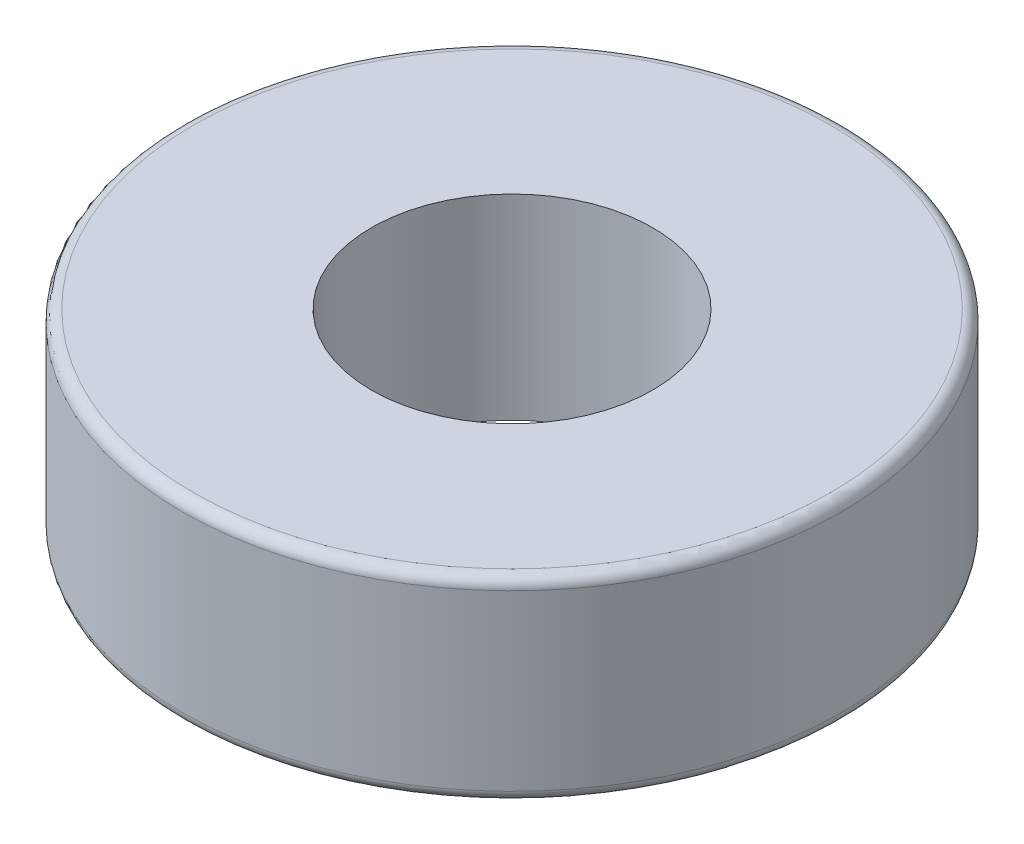
ISO-10303-21;
HEADER;
FILE_DESCRIPTION(('STEP AP214'),'2;1');
FILE_NAME('part.step','',(''),(''),'','','');
FILE_SCHEMA(('AUTOMOTIVE_DESIGN { 1 0 10303 214 1 1 1 1 }'));
ENDSEC;
DATA;
#1=APPLICATION_CONTEXT('core data for automotive mechanical design processes');
#2=APPLICATION_PROTOCOL_DEFINITION('international standard','automotive_design',2000,#1);
#3=PRODUCT_CONTEXT('',#1,'mechanical');
#4=PRODUCT('Part','Part','',(#3));
#5=PRODUCT_RELATED_PRODUCT_CATEGORY('part','',(#4));
#6=PRODUCT_DEFINITION_FORMATION('','',#4);
#7=PRODUCT_DEFINITION_CONTEXT('part definition',#1,'design');
#8=PRODUCT_DEFINITION('design','',#6,#7);
#9=PRODUCT_DEFINITION_SHAPE('','',#8);
#10=(LENGTH_UNIT() NAMED_UNIT(*) SI_UNIT(.MILLI.,.METRE.));
#11=(NAMED_UNIT(*) PLANE_ANGLE_UNIT() SI_UNIT($,.RADIAN.));
#12=(NAMED_UNIT(*) SI_UNIT($,.STERADIAN.) SOLID_ANGLE_UNIT());
#13=UNCERTAINTY_MEASURE_WITH_UNIT(LENGTH_MEASURE(1.E-05),#10,'distance_accuracy_value','');
#14=(GEOMETRIC_REPRESENTATION_CONTEXT(3) GLOBAL_UNCERTAINTY_ASSIGNED_CONTEXT((#13)) GLOBAL_UNIT_ASSIGNED_CONTEXT((#10,
#11,#12)) REPRESENTATION_CONTEXT('',''));
#15=CARTESIAN_POINT('',(0.,0.,0.));
#16=DIRECTION('',(0.,0.,1.));
#17=DIRECTION('',(1.,0.,0.));
#18=AXIS2_PLACEMENT_3D('',#15,#16,#17);
#19=CARTESIAN_POINT('',(0.,13.97,0.));
#20=DIRECTION('',(0.,1.,0.));
#21=DIRECTION('',(0.,0.,1.));
#22=AXIS2_PLACEMENT_3D('',#19,#20,#21);
#23=PLANE('',#22);
#24=CARTESIAN_POINT('',(0.,13.97,0.));
#25=DIRECTION('',(0.,1.,0.));
#26=DIRECTION('',(0.,0.,1.));
#27=AXIS2_PLACEMENT_3D('',#24,#25,#26);
#28=CIRCLE('',#27,22.70125);
#29=CARTESIAN_POINT('',(0.,13.97,22.70125));
#30=VERTEX_POINT('',#29);
#31=EDGE_CURVE('E10',#30,#30,#28,.T.);
#32=ORIENTED_EDGE('',*,*,#31,.T.);
#33=EDGE_LOOP('',(#32));
#34=FACE_BOUND('',#33,.T.);
#35=CARTESIAN_POINT('',(0.,13.97,0.));
#36=DIRECTION('',(0.,1.,0.));
#37=DIRECTION('',(0.,0.,1.));
#38=AXIS2_PLACEMENT_3D('',#35,#36,#37);
#39=CIRCLE('',#38,10.033);
#40=CARTESIAN_POINT('',(0.,13.97,10.033));
#41=VERTEX_POINT('',#40);
#42=EDGE_CURVE('E57',#41,#41,#39,.T.);
#43=ORIENTED_EDGE('',*,*,#42,.F.);
#44=EDGE_LOOP('',(#43));
#45=FACE_BOUND('',#44,.T.);
#46=ADVANCED_FACE('F37',(#34,#45),#23,.T.);
#47=CARTESIAN_POINT('',(0.,0.,0.));
#48=DIRECTION('',(0.,1.,0.));
#49=DIRECTION('',(0.,0.,1.));
#50=AXIS2_PLACEMENT_3D('',#47,#48,#49);
#51=PLANE('',#50);
#52=CARTESIAN_POINT('',(0.,0.,0.));
#53=DIRECTION('',(0.,1.,0.));
#54=DIRECTION('',(0.,0.,1.));
#55=AXIS2_PLACEMENT_3D('',#52,#53,#54);
#56=CIRCLE('',#55,22.70125);
#57=CARTESIAN_POINT('',(0.,0.,22.70125));
#58=VERTEX_POINT('',#57);
#59=EDGE_CURVE('E44',#58,#58,#56,.F.);
#60=ORIENTED_EDGE('',*,*,#59,.T.);
#61=EDGE_LOOP('',(#60));
#62=FACE_BOUND('',#61,.T.);
#63=CARTESIAN_POINT('',(0.,0.,0.));
#64=DIRECTION('',(0.,1.,0.));
#65=DIRECTION('',(0.,0.,1.));
#66=AXIS2_PLACEMENT_3D('',#63,#64,#65);
#67=CIRCLE('',#66,10.033);
#68=CARTESIAN_POINT('',(0.,0.,10.033));
#69=VERTEX_POINT('',#68);
#70=EDGE_CURVE('E58',#69,#69,#67,.T.);
#71=ORIENTED_EDGE('',*,*,#70,.T.);
#72=EDGE_LOOP('',(#71));
#73=FACE_BOUND('',#72,.T.);
#74=ADVANCED_FACE('F68',(#62,#73),#51,.F.);
#75=CARTESIAN_POINT('',(0.,13.97,0.));
#76=DIRECTION('',(0.,-1.,0.));
#77=DIRECTION('',(0.,0.,-1.));
#78=AXIS2_PLACEMENT_3D('',#75,#76,#77);
#79=CYLINDRICAL_SURFACE('',#78,23.495);
#80=CARTESIAN_POINT('',(0.,0.793749999999999,0.));
#81=DIRECTION('',(0.,1.,0.));
#82=DIRECTION('',(0.,0.,1.));
#83=AXIS2_PLACEMENT_3D('',#80,#81,#82);
#84=CIRCLE('',#83,23.495);
#85=CARTESIAN_POINT('',(0.,0.793749999999999,23.495));
#86=VERTEX_POINT('',#85);
#87=EDGE_CURVE('E48',#86,#86,#84,.T.);
#88=ORIENTED_EDGE('',*,*,#87,.T.);
#89=EDGE_LOOP('',(#88));
#90=FACE_BOUND('',#89,.T.);
#91=CARTESIAN_POINT('',(0.,13.17625,0.));
#92=DIRECTION('',(0.,1.,0.));
#93=DIRECTION('',(0.,0.,1.));
#94=AXIS2_PLACEMENT_3D('',#91,#92,#93);
#95=CIRCLE('',#94,23.495);
#96=CARTESIAN_POINT('',(0.,13.17625,23.495));
#97=VERTEX_POINT('',#96);
#98=EDGE_CURVE('E52',#97,#97,#95,.F.);
#99=ORIENTED_EDGE('',*,*,#98,.T.);
#100=EDGE_LOOP('',(#99));
#101=FACE_BOUND('',#100,.T.);
#102=ADVANCED_FACE('F73',(#90,#101),#79,.T.);
#103=CARTESIAN_POINT('',(0.,13.97,0.));
#104=DIRECTION('',(0.,-1.,0.));
#105=DIRECTION('',(0.,0.,-1.));
#106=AXIS2_PLACEMENT_3D('',#103,#104,#105);
#107=CYLINDRICAL_SURFACE('',#106,10.033);
#108=ORIENTED_EDGE('',*,*,#42,.T.);
#109=EDGE_LOOP('',(#108));
#110=FACE_BOUND('',#109,.T.);
#111=ORIENTED_EDGE('',*,*,#70,.F.);
#112=EDGE_LOOP('',(#111));
#113=FACE_BOUND('',#112,.T.);
#114=ADVANCED_FACE('F64',(#110,#113),#107,.F.);
#115=CARTESIAN_POINT('',(0.,0.793749999999999,0.));
#116=DIRECTION('',(0.,1.,0.));
#117=DIRECTION('',(0.,0.,1.));
#118=AXIS2_PLACEMENT_3D('',#115,#116,#117);
#119=TOROIDAL_SURFACE('',#118,22.70125,0.79375);
#120=ORIENTED_EDGE('',*,*,#59,.F.);
#121=EDGE_LOOP('',(#120));
#122=FACE_BOUND('',#121,.T.);
#123=ORIENTED_EDGE('',*,*,#87,.F.);
#124=EDGE_LOOP('',(#123));
#125=FACE_BOUND('',#124,.T.);
#126=ADVANCED_FACE('F79',(#122,#125),#119,.T.);
#127=CARTESIAN_POINT('',(0.,13.17625,0.));
#128=DIRECTION('',(0.,1.,0.));
#129=DIRECTION('',(0.,0.,1.));
#130=AXIS2_PLACEMENT_3D('',#127,#128,#129);
#131=TOROIDAL_SURFACE('',#130,22.70125,0.79375);
#132=ORIENTED_EDGE('',*,*,#98,.F.);
#133=EDGE_LOOP('',(#132));
#134=FACE_BOUND('',#133,.T.);
#135=ORIENTED_EDGE('',*,*,#31,.F.);
#136=EDGE_LOOP('',(#135));
#137=FACE_BOUND('',#136,.T.);
#138=ADVANCED_FACE('F39',(#134,#137),#131,.T.);
#139=CLOSED_SHELL('',(#46,#74,#102,#114,#126,#138));
#140=MANIFOLD_SOLID_BREP('B2',#139);
#141=ADVANCED_BREP_SHAPE_REPRESENTATION('',(#18,#140),#14);
#142=SHAPE_DEFINITION_REPRESENTATION(#9,#141);
ENDSEC;
END-ISO-10303-21;
